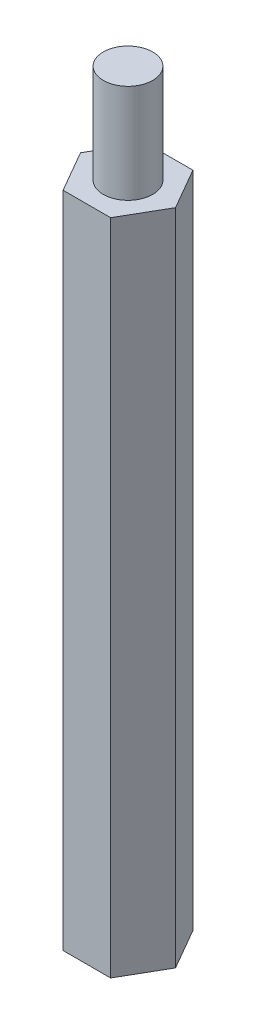
ISO-10303-21;
HEADER;
FILE_DESCRIPTION(('STEP AP214'),'2;1');
FILE_NAME('part.step','',(''),(''),'','','');
FILE_SCHEMA(('AUTOMOTIVE_DESIGN { 1 0 10303 214 1 1 1 1 }'));
ENDSEC;
DATA;
#1=APPLICATION_CONTEXT('core data for automotive mechanical design processes');
#2=APPLICATION_PROTOCOL_DEFINITION('international standard','automotive_design',2000,#1);
#3=PRODUCT_CONTEXT('',#1,'mechanical');
#4=PRODUCT('Part','Part','',(#3));
#5=PRODUCT_RELATED_PRODUCT_CATEGORY('part','',(#4));
#6=PRODUCT_DEFINITION_FORMATION('','',#4);
#7=PRODUCT_DEFINITION_CONTEXT('part definition',#1,'design');
#8=PRODUCT_DEFINITION('design','',#6,#7);
#9=PRODUCT_DEFINITION_SHAPE('','',#8);
#10=(LENGTH_UNIT() NAMED_UNIT(*) SI_UNIT(.MILLI.,.METRE.));
#11=(NAMED_UNIT(*) PLANE_ANGLE_UNIT() SI_UNIT($,.RADIAN.));
#12=(NAMED_UNIT(*) SI_UNIT($,.STERADIAN.) SOLID_ANGLE_UNIT());
#13=UNCERTAINTY_MEASURE_WITH_UNIT(LENGTH_MEASURE(1.E-05),#10,'distance_accuracy_value','');
#14=(GEOMETRIC_REPRESENTATION_CONTEXT(3) GLOBAL_UNCERTAINTY_ASSIGNED_CONTEXT((#13)) GLOBAL_UNIT_ASSIGNED_CONTEXT((#10,
#11,#12)) REPRESENTATION_CONTEXT('',''));
#15=CARTESIAN_POINT('',(0.,0.,0.));
#16=DIRECTION('',(0.,0.,1.));
#17=DIRECTION('',(1.,0.,0.));
#18=AXIS2_PLACEMENT_3D('',#15,#16,#17);
#19=CARTESIAN_POINT('',(1.44337567297406,20.,2.5));
#20=DIRECTION('',(-0.866025403784439,0.,-0.5));
#21=DIRECTION('',(-0.5,0.,0.866025403784439));
#22=AXIS2_PLACEMENT_3D('',#19,#20,#21);
#23=PLANE('',#22);
#24=DIRECTION('',(0.5,0.,-0.866025403784439));
#25=VECTOR('',#24,1.);
#26=CARTESIAN_POINT('',(1.44337567297406,-20.,2.5));
#27=LINE('',#26,#25);
#28=CARTESIAN_POINT('',(1.44337567297406,-20.,2.5));
#29=VERTEX_POINT('',#28);
#30=CARTESIAN_POINT('',(2.88675134594813,-20.,0.));
#31=VERTEX_POINT('',#30);
#32=EDGE_CURVE('E103',#29,#31,#27,.T.);
#33=ORIENTED_EDGE('',*,*,#32,.T.);
#34=DIRECTION('',(0.,-1.,0.));
#35=VECTOR('',#34,1.);
#36=CARTESIAN_POINT('',(2.88675134594813,20.,0.));
#37=LINE('',#36,#35);
#38=CARTESIAN_POINT('',(2.88675134594813,20.,0.));
#39=VERTEX_POINT('',#38);
#40=EDGE_CURVE('E20',#39,#31,#37,.T.);
#41=ORIENTED_EDGE('',*,*,#40,.F.);
#42=DIRECTION('',(0.5,0.,-0.866025403784439));
#43=VECTOR('',#42,1.);
#44=CARTESIAN_POINT('',(1.44337567297406,20.,2.5));
#45=LINE('',#44,#43);
#46=CARTESIAN_POINT('',(1.44337567297406,20.,2.5));
#47=VERTEX_POINT('',#46);
#48=EDGE_CURVE('E114',#47,#39,#45,.T.);
#49=ORIENTED_EDGE('',*,*,#48,.F.);
#50=DIRECTION('',(0.,-1.,0.));
#51=VECTOR('',#50,1.);
#52=CARTESIAN_POINT('',(1.44337567297406,20.,2.5));
#53=LINE('',#52,#51);
#54=EDGE_CURVE('E99',#47,#29,#53,.T.);
#55=ORIENTED_EDGE('',*,*,#54,.T.);
#56=EDGE_LOOP('',(#33,#41,#49,#55));
#57=FACE_BOUND('',#56,.T.);
#58=ADVANCED_FACE('F17',(#57),#23,.F.);
#59=CARTESIAN_POINT('',(2.88675134594813,20.,0.));
#60=DIRECTION('',(-0.866025403784439,0.,0.5));
#61=DIRECTION('',(0.5,0.,0.866025403784439));
#62=AXIS2_PLACEMENT_3D('',#59,#60,#61);
#63=PLANE('',#62);
#64=DIRECTION('',(-0.5,0.,-0.866025403784439));
#65=VECTOR('',#64,1.);
#66=CARTESIAN_POINT('',(2.88675134594813,-20.,0.));
#67=LINE('',#66,#65);
#68=CARTESIAN_POINT('',(1.44337567297406,-20.,-2.5));
#69=VERTEX_POINT('',#68);
#70=EDGE_CURVE('E106',#31,#69,#67,.T.);
#71=ORIENTED_EDGE('',*,*,#70,.T.);
#72=DIRECTION('',(0.,-1.,0.));
#73=VECTOR('',#72,1.);
#74=CARTESIAN_POINT('',(1.44337567297406,20.,-2.5));
#75=LINE('',#74,#73);
#76=CARTESIAN_POINT('',(1.44337567297406,20.,-2.5));
#77=VERTEX_POINT('',#76);
#78=EDGE_CURVE('E117',#77,#69,#75,.T.);
#79=ORIENTED_EDGE('',*,*,#78,.F.);
#80=DIRECTION('',(-0.5,0.,-0.866025403784439));
#81=VECTOR('',#80,1.);
#82=CARTESIAN_POINT('',(2.88675134594813,20.,0.));
#83=LINE('',#82,#81);
#84=EDGE_CURVE('E72',#39,#77,#83,.T.);
#85=ORIENTED_EDGE('',*,*,#84,.F.);
#86=ORIENTED_EDGE('',*,*,#40,.T.);
#87=EDGE_LOOP('',(#71,#79,#85,#86));
#88=FACE_BOUND('',#87,.T.);
#89=ADVANCED_FACE('F122',(#88),#63,.F.);
#90=CARTESIAN_POINT('',(1.44337567297406,20.,-2.5));
#91=DIRECTION('',(0.,0.,1.));
#92=DIRECTION('',(1.,0.,0.));
#93=AXIS2_PLACEMENT_3D('',#90,#91,#92);
#94=PLANE('',#93);
#95=DIRECTION('',(-1.,0.,0.));
#96=VECTOR('',#95,1.);
#97=CARTESIAN_POINT('',(1.44337567297406,-20.,-2.5));
#98=LINE('',#97,#96);
#99=CARTESIAN_POINT('',(-1.44337567297406,-20.,-2.5));
#100=VERTEX_POINT('',#99);
#101=EDGE_CURVE('E109',#69,#100,#98,.T.);
#102=ORIENTED_EDGE('',*,*,#101,.T.);
#103=DIRECTION('',(0.,-1.,0.));
#104=VECTOR('',#103,1.);
#105=CARTESIAN_POINT('',(-1.44337567297406,20.,-2.5));
#106=LINE('',#105,#104);
#107=CARTESIAN_POINT('',(-1.44337567297406,20.,-2.5));
#108=VERTEX_POINT('',#107);
#109=EDGE_CURVE('E94',#108,#100,#106,.T.);
#110=ORIENTED_EDGE('',*,*,#109,.F.);
#111=DIRECTION('',(-1.,0.,0.));
#112=VECTOR('',#111,1.);
#113=CARTESIAN_POINT('',(1.44337567297406,20.,-2.5));
#114=LINE('',#113,#112);
#115=EDGE_CURVE('E85',#77,#108,#114,.T.);
#116=ORIENTED_EDGE('',*,*,#115,.F.);
#117=ORIENTED_EDGE('',*,*,#78,.T.);
#118=EDGE_LOOP('',(#102,#110,#116,#117));
#119=FACE_BOUND('',#118,.T.);
#120=ADVANCED_FACE('F128',(#119),#94,.F.);
#121=CARTESIAN_POINT('',(-1.44337567297406,20.,-2.5));
#122=DIRECTION('',(0.866025403784439,0.,0.5));
#123=DIRECTION('',(0.5,0.,-0.866025403784439));
#124=AXIS2_PLACEMENT_3D('',#121,#122,#123);
#125=PLANE('',#124);
#126=DIRECTION('',(-0.5,0.,0.866025403784439));
#127=VECTOR('',#126,1.);
#128=CARTESIAN_POINT('',(-1.44337567297406,-20.,-2.5));
#129=LINE('',#128,#127);
#130=CARTESIAN_POINT('',(-2.88675134594813,-20.,0.));
#131=VERTEX_POINT('',#130);
#132=EDGE_CURVE('E93',#100,#131,#129,.T.);
#133=ORIENTED_EDGE('',*,*,#132,.T.);
#134=DIRECTION('',(0.,-1.,0.));
#135=VECTOR('',#134,1.);
#136=CARTESIAN_POINT('',(-2.88675134594813,20.,0.));
#137=LINE('',#136,#135);
#138=CARTESIAN_POINT('',(-2.88675134594813,20.,0.));
#139=VERTEX_POINT('',#138);
#140=EDGE_CURVE('E90',#139,#131,#137,.T.);
#141=ORIENTED_EDGE('',*,*,#140,.F.);
#142=DIRECTION('',(-0.5,0.,0.866025403784439));
#143=VECTOR('',#142,1.);
#144=CARTESIAN_POINT('',(-1.44337567297406,20.,-2.5));
#145=LINE('',#144,#143);
#146=EDGE_CURVE('E79',#108,#139,#145,.T.);
#147=ORIENTED_EDGE('',*,*,#146,.F.);
#148=ORIENTED_EDGE('',*,*,#109,.T.);
#149=EDGE_LOOP('',(#133,#141,#147,#148));
#150=FACE_BOUND('',#149,.T.);
#151=ADVANCED_FACE('F91',(#150),#125,.F.);
#152=CARTESIAN_POINT('',(-2.88675134594813,20.,0.));
#153=DIRECTION('',(0.866025403784439,0.,-0.5));
#154=DIRECTION('',(-0.5,0.,-0.866025403784439));
#155=AXIS2_PLACEMENT_3D('',#152,#153,#154);
#156=PLANE('',#155);
#157=DIRECTION('',(0.5,0.,0.866025403784439));
#158=VECTOR('',#157,1.);
#159=CARTESIAN_POINT('',(-2.88675134594813,-20.,0.));
#160=LINE('',#159,#158);
#161=CARTESIAN_POINT('',(-1.44337567297406,-20.,2.5));
#162=VERTEX_POINT('',#161);
#163=EDGE_CURVE('E57',#131,#162,#160,.T.);
#164=ORIENTED_EDGE('',*,*,#163,.T.);
#165=DIRECTION('',(0.,-1.,0.));
#166=VECTOR('',#165,1.);
#167=CARTESIAN_POINT('',(-1.44337567297406,20.,2.5));
#168=LINE('',#167,#166);
#169=CARTESIAN_POINT('',(-1.44337567297406,20.,2.5));
#170=VERTEX_POINT('',#169);
#171=EDGE_CURVE('E95',#170,#162,#168,.T.);
#172=ORIENTED_EDGE('',*,*,#171,.F.);
#173=DIRECTION('',(0.5,0.,0.866025403784439));
#174=VECTOR('',#173,1.);
#175=CARTESIAN_POINT('',(-2.88675134594813,20.,0.));
#176=LINE('',#175,#174);
#177=EDGE_CURVE('E83',#139,#170,#176,.T.);
#178=ORIENTED_EDGE('',*,*,#177,.F.);
#179=ORIENTED_EDGE('',*,*,#140,.T.);
#180=EDGE_LOOP('',(#164,#172,#178,#179));
#181=FACE_BOUND('',#180,.T.);
#182=ADVANCED_FACE('F97',(#181),#156,.F.);
#183=CARTESIAN_POINT('',(-1.44337567297406,20.,2.5));
#184=DIRECTION('',(0.,0.,-1.));
#185=DIRECTION('',(-1.,0.,0.));
#186=AXIS2_PLACEMENT_3D('',#183,#184,#185);
#187=PLANE('',#186);
#188=DIRECTION('',(1.,0.,0.));
#189=VECTOR('',#188,1.);
#190=CARTESIAN_POINT('',(-1.44337567297406,-20.,2.5));
#191=LINE('',#190,#189);
#192=EDGE_CURVE('E63',#162,#29,#191,.T.);
#193=ORIENTED_EDGE('',*,*,#192,.T.);
#194=ORIENTED_EDGE('',*,*,#54,.F.);
#195=DIRECTION('',(1.,0.,0.));
#196=VECTOR('',#195,1.);
#197=CARTESIAN_POINT('',(-1.44337567297406,20.,2.5));
#198=LINE('',#197,#196);
#199=EDGE_CURVE('E34',#170,#47,#198,.T.);
#200=ORIENTED_EDGE('',*,*,#199,.F.);
#201=ORIENTED_EDGE('',*,*,#171,.T.);
#202=EDGE_LOOP('',(#193,#194,#200,#201));
#203=FACE_BOUND('',#202,.T.);
#204=ADVANCED_FACE('F151',(#203),#187,.F.);
#205=CARTESIAN_POINT('',(0.,20.,0.));
#206=DIRECTION('',(0.,1.,0.));
#207=DIRECTION('',(0.,0.,1.));
#208=AXIS2_PLACEMENT_3D('',#205,#206,#207);
#209=PLANE('',#208);
#210=CARTESIAN_POINT('',(0.,20.,0.));
#211=DIRECTION('',(0.,1.,0.));
#212=DIRECTION('',(0.,0.,1.));
#213=AXIS2_PLACEMENT_3D('',#210,#211,#212);
#214=CIRCLE('',#213,1.5);
#215=CARTESIAN_POINT('',(0.,20.,1.5));
#216=VERTEX_POINT('',#215);
#217=EDGE_CURVE('E11',#216,#216,#214,.T.);
#218=ORIENTED_EDGE('',*,*,#217,.F.);
#219=EDGE_LOOP('',(#218));
#220=FACE_BOUND('',#219,.T.);
#221=ORIENTED_EDGE('',*,*,#48,.T.);
#222=ORIENTED_EDGE('',*,*,#84,.T.);
#223=ORIENTED_EDGE('',*,*,#115,.T.);
#224=ORIENTED_EDGE('',*,*,#146,.T.);
#225=ORIENTED_EDGE('',*,*,#177,.T.);
#226=ORIENTED_EDGE('',*,*,#199,.T.);
#227=EDGE_LOOP('',(#221,#222,#223,#224,#225,#226));
#228=FACE_BOUND('',#227,.T.);
#229=ADVANCED_FACE('F81',(#220,#228),#209,.T.);
#230=CARTESIAN_POINT('',(0.,-20.,0.));
#231=DIRECTION('',(0.,1.,0.));
#232=DIRECTION('',(0.,0.,1.));
#233=AXIS2_PLACEMENT_3D('',#230,#231,#232);
#234=PLANE('',#233);
#235=CARTESIAN_POINT('',(0.,-20.,0.));
#236=DIRECTION('',(0.,-1.,0.));
#237=DIRECTION('',(0.,0.,-1.));
#238=AXIS2_PLACEMENT_3D('',#235,#236,#237);
#239=CIRCLE('',#238,1.5);
#240=CARTESIAN_POINT('',(0.,-20.,-1.5));
#241=VERTEX_POINT('',#240);
#242=EDGE_CURVE('E132',#241,#241,#239,.T.);
#243=ORIENTED_EDGE('',*,*,#242,.F.);
#244=EDGE_LOOP('',(#243));
#245=FACE_BOUND('',#244,.T.);
#246=ORIENTED_EDGE('',*,*,#32,.F.);
#247=ORIENTED_EDGE('',*,*,#192,.F.);
#248=ORIENTED_EDGE('',*,*,#163,.F.);
#249=ORIENTED_EDGE('',*,*,#132,.F.);
#250=ORIENTED_EDGE('',*,*,#101,.F.);
#251=ORIENTED_EDGE('',*,*,#70,.F.);
#252=EDGE_LOOP('',(#246,#247,#248,#249,#250,#251));
#253=FACE_BOUND('',#252,.T.);
#254=ADVANCED_FACE('F127',(#245,#253),#234,.F.);
#255=CARTESIAN_POINT('',(0.,-12.,0.));
#256=DIRECTION('',(0.,-1.,0.));
#257=DIRECTION('',(0.,0.,-1.));
#258=AXIS2_PLACEMENT_3D('',#255,#256,#257);
#259=CYLINDRICAL_SURFACE('',#258,1.5);
#260=CARTESIAN_POINT('',(0.,-12.,0.));
#261=DIRECTION('',(0.,-1.,0.));
#262=DIRECTION('',(0.,0.,-1.));
#263=AXIS2_PLACEMENT_3D('',#260,#261,#262);
#264=CIRCLE('',#263,1.5);
#265=CARTESIAN_POINT('',(0.,-12.,-1.5));
#266=VERTEX_POINT('',#265);
#267=EDGE_CURVE('E107',#266,#266,#264,.T.);
#268=ORIENTED_EDGE('',*,*,#267,.F.);
#269=EDGE_LOOP('',(#268));
#270=FACE_BOUND('',#269,.T.);
#271=ORIENTED_EDGE('',*,*,#242,.T.);
#272=EDGE_LOOP('',(#271));
#273=FACE_BOUND('',#272,.T.);
#274=ADVANCED_FACE('F159',(#270,#273),#259,.F.);
#275=CARTESIAN_POINT('',(0.,-12.,0.));
#276=DIRECTION('',(0.,-1.,0.));
#277=DIRECTION('',(0.,0.,-1.));
#278=AXIS2_PLACEMENT_3D('',#275,#276,#277);
#279=PLANE('',#278);
#280=ORIENTED_EDGE('',*,*,#267,.T.);
#281=EDGE_LOOP('',(#280));
#282=FACE_BOUND('',#281,.T.);
#283=ADVANCED_FACE('F146',(#282),#279,.T.);
#284=CARTESIAN_POINT('',(0.,26.,0.));
#285=DIRECTION('',(0.,-1.,0.));
#286=DIRECTION('',(0.,0.,-1.));
#287=AXIS2_PLACEMENT_3D('',#284,#285,#286);
#288=CYLINDRICAL_SURFACE('',#287,1.5);
#289=CARTESIAN_POINT('',(0.,26.,0.));
#290=DIRECTION('',(0.,1.,0.));
#291=DIRECTION('',(0.,0.,1.));
#292=AXIS2_PLACEMENT_3D('',#289,#290,#291);
#293=CIRCLE('',#292,1.5);
#294=CARTESIAN_POINT('',(0.,26.,1.5));
#295=VERTEX_POINT('',#294);
#296=EDGE_CURVE('E135',#295,#295,#293,.T.);
#297=ORIENTED_EDGE('',*,*,#296,.F.);
#298=EDGE_LOOP('',(#297));
#299=FACE_BOUND('',#298,.T.);
#300=ORIENTED_EDGE('',*,*,#217,.T.);
#301=EDGE_LOOP('',(#300));
#302=FACE_BOUND('',#301,.T.);
#303=ADVANCED_FACE('F143',(#299,#302),#288,.T.);
#304=CARTESIAN_POINT('',(0.,26.,0.));
#305=DIRECTION('',(0.,1.,0.));
#306=DIRECTION('',(0.,0.,1.));
#307=AXIS2_PLACEMENT_3D('',#304,#305,#306);
#308=PLANE('',#307);
#309=ORIENTED_EDGE('',*,*,#296,.T.);
#310=EDGE_LOOP('',(#309));
#311=FACE_BOUND('',#310,.T.);
#312=ADVANCED_FACE('F141',(#311),#308,.T.);
#313=CLOSED_SHELL('',(#58,#89,#120,#151,#182,#204,#229,#254,#274,#283,#303,#312));
#314=MANIFOLD_SOLID_BREP('B1',#313);
#315=ADVANCED_BREP_SHAPE_REPRESENTATION('',(#18,#314),#14);
#316=SHAPE_DEFINITION_REPRESENTATION(#9,#315);
ENDSEC;
END-ISO-10303-21;
